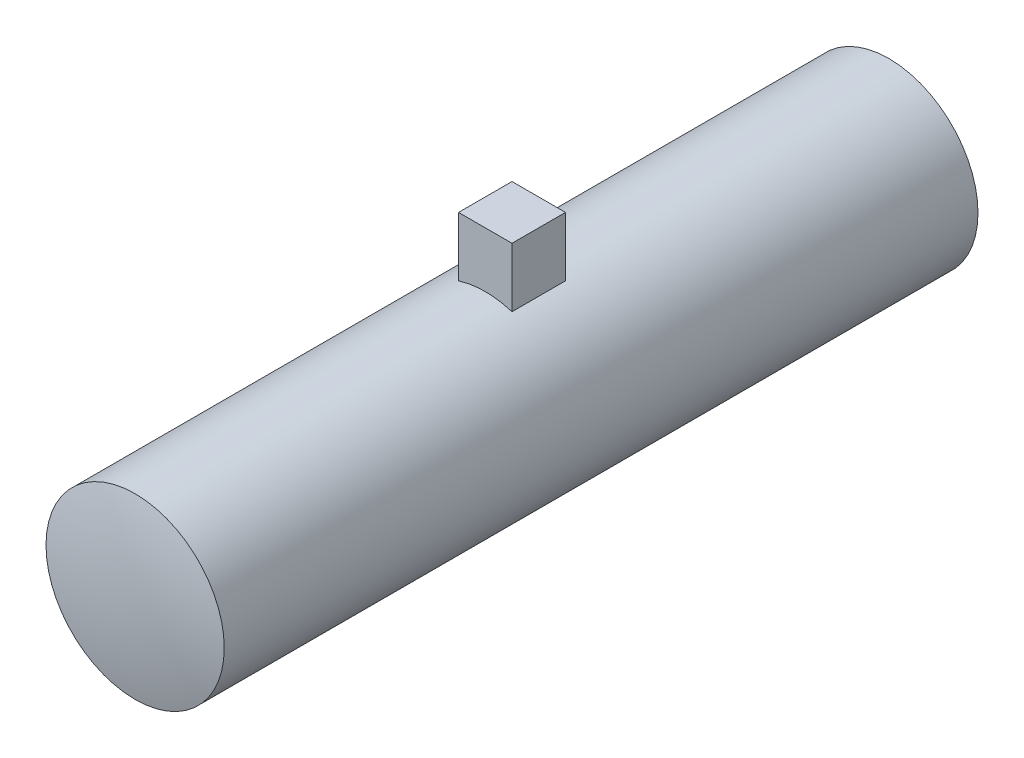
ISO-10303-21;
HEADER;
FILE_DESCRIPTION(('STEP AP214'),'2;1');
FILE_NAME('part.step','',(''),(''),'','','');
FILE_SCHEMA(('AUTOMOTIVE_DESIGN { 1 0 10303 214 1 1 1 1 }'));
ENDSEC;
DATA;
#1=APPLICATION_CONTEXT('core data for automotive mechanical design processes');
#2=APPLICATION_PROTOCOL_DEFINITION('international standard','automotive_design',2000,#1);
#3=PRODUCT_CONTEXT('',#1,'mechanical');
#4=PRODUCT('Part','Part','',(#3));
#5=PRODUCT_RELATED_PRODUCT_CATEGORY('part','',(#4));
#6=PRODUCT_DEFINITION_FORMATION('','',#4);
#7=PRODUCT_DEFINITION_CONTEXT('part definition',#1,'design');
#8=PRODUCT_DEFINITION('design','',#6,#7);
#9=PRODUCT_DEFINITION_SHAPE('','',#8);
#10=(LENGTH_UNIT() NAMED_UNIT(*) SI_UNIT(.MILLI.,.METRE.));
#11=(NAMED_UNIT(*) PLANE_ANGLE_UNIT() SI_UNIT($,.RADIAN.));
#12=(NAMED_UNIT(*) SI_UNIT($,.STERADIAN.) SOLID_ANGLE_UNIT());
#13=UNCERTAINTY_MEASURE_WITH_UNIT(LENGTH_MEASURE(1.E-05),#10,'distance_accuracy_value','');
#14=(GEOMETRIC_REPRESENTATION_CONTEXT(3) GLOBAL_UNCERTAINTY_ASSIGNED_CONTEXT((#13)) GLOBAL_UNIT_ASSIGNED_CONTEXT((#10,
#11,#12)) REPRESENTATION_CONTEXT('',''));
#15=CARTESIAN_POINT('',(0.,0.,0.));
#16=DIRECTION('',(0.,0.,1.));
#17=DIRECTION('',(1.,0.,0.));
#18=AXIS2_PLACEMENT_3D('',#15,#16,#17);
#19=CARTESIAN_POINT('',(67.5239734830013,-22.0957790107268,0.));
#20=DIRECTION('',(0.,-1.,0.));
#21=DIRECTION('',(-1.,0.,0.));
#22=AXIS2_PLACEMENT_3D('',#19,#20,#21);
#23=SPHERICAL_SURFACE('',#22,21.73);
#24=CARTESIAN_POINT('',(67.5239734830013,-22.0957790107268,0.));
#25=DIRECTION('',(0.,0.,1.));
#26=DIRECTION('',(1.,0.,0.));
#27=AXIS2_PLACEMENT_3D('',#24,#25,#26);
#28=SPHERICAL_SURFACE('',#27,21.73);
#29=CARTESIAN_POINT('',(67.5239734830013,-22.0957790107268,-21.1469359482645));
#30=DIRECTION('',(0.,0.,1.));
#31=DIRECTION('',(1.,0.,0.));
#32=AXIS2_PLACEMENT_3D('',#29,#30,#31);
#33=CIRCLE('',#32,5.);
#34=CARTESIAN_POINT('',(72.5239734830013,-22.0957790107268,-21.1469359482645));
#35=VERTEX_POINT('',#34);
#36=EDGE_CURVE('E106',#35,#35,#33,.F.);
#37=ORIENTED_EDGE('',*,*,#36,.T.);
#38=EDGE_LOOP('',(#37));
#39=FACE_BOUND('',#38,.T.);
#40=ADVANCED_FACE('F35',(#39),#28,.T.);
#41=CARTESIAN_POINT('',(67.5239734830013,-22.0957790107268,65.));
#42=DIRECTION('',(0.,0.,-1.));
#43=DIRECTION('',(-1.,0.,0.));
#44=AXIS2_PLACEMENT_3D('',#41,#42,#43);
#45=CYLINDRICAL_SURFACE('',#44,5.);
#46=CARTESIAN_POINT('',(67.5239734830013,-22.0957790107268,-1.5));
#47=DIRECTION('',(0.,0.,-1.));
#48=DIRECTION('',(-1.,0.,0.));
#49=AXIS2_PLACEMENT_3D('',#46,#47,#48);
#50=CIRCLE('',#49,5.);
#51=CARTESIAN_POINT('',(66.0239734830012,-17.326083003642,-1.5));
#52=VERTEX_POINT('',#51);
#53=CARTESIAN_POINT('',(69.0239734830012,-17.326083003642,-1.5));
#54=VERTEX_POINT('',#53);
#55=EDGE_CURVE('E43',#52,#54,#50,.T.);
#56=ORIENTED_EDGE('',*,*,#55,.T.);
#57=DIRECTION('',(0.,0.,-1.));
#58=VECTOR('',#57,1.);
#59=CARTESIAN_POINT('',(69.0239734830012,-17.326083003642,65.));
#60=LINE('',#59,#58);
#61=CARTESIAN_POINT('',(69.0239734830012,-17.326083003642,1.5));
#62=VERTEX_POINT('',#61);
#63=EDGE_CURVE('E12',#54,#62,#60,.F.);
#64=ORIENTED_EDGE('',*,*,#63,.T.);
#65=CARTESIAN_POINT('',(67.5239734830013,-22.0957790107268,1.5));
#66=DIRECTION('',(0.,0.,-1.));
#67=DIRECTION('',(-1.,0.,0.));
#68=AXIS2_PLACEMENT_3D('',#65,#66,#67);
#69=CIRCLE('',#68,5.);
#70=CARTESIAN_POINT('',(66.0239734830012,-17.326083003642,1.5));
#71=VERTEX_POINT('',#70);
#72=EDGE_CURVE('E109',#71,#62,#69,.T.);
#73=ORIENTED_EDGE('',*,*,#72,.F.);
#74=DIRECTION('',(0.,0.,-1.));
#75=VECTOR('',#74,1.);
#76=CARTESIAN_POINT('',(66.0239734830012,-17.326083003642,65.));
#77=LINE('',#76,#75);
#78=EDGE_CURVE('E53',#52,#71,#77,.F.);
#79=ORIENTED_EDGE('',*,*,#78,.F.);
#80=EDGE_LOOP('',(#56,#64,#73,#79));
#81=FACE_BOUND('',#80,.T.);
#82=CARTESIAN_POINT('',(67.5239734830013,-22.0957790107268,21.1469359482645));
#83=DIRECTION('',(0.,0.,-1.));
#84=DIRECTION('',(-1.,0.,0.));
#85=AXIS2_PLACEMENT_3D('',#82,#83,#84);
#86=CIRCLE('',#85,5.);
#87=CARTESIAN_POINT('',(62.5239734830012,-22.0957790107268,21.1469359482645));
#88=VERTEX_POINT('',#87);
#89=EDGE_CURVE('E79',#88,#88,#86,.F.);
#90=ORIENTED_EDGE('',*,*,#89,.F.);
#91=EDGE_LOOP('',(#90));
#92=FACE_BOUND('',#91,.T.);
#93=ORIENTED_EDGE('',*,*,#36,.F.);
#94=EDGE_LOOP('',(#93));
#95=FACE_BOUND('',#94,.T.);
#96=ADVANCED_FACE('F117',(#81,#92,#95),#45,.T.);
#97=CARTESIAN_POINT('',(67.5239734830013,-22.0957790107268,0.));
#98=DIRECTION('',(0.,0.,-1.));
#99=DIRECTION('',(-1.,0.,0.));
#100=AXIS2_PLACEMENT_3D('',#97,#98,#99);
#101=SPHERICAL_SURFACE('',#100,21.73);
#102=ORIENTED_EDGE('',*,*,#89,.T.);
#103=EDGE_LOOP('',(#102));
#104=FACE_BOUND('',#103,.T.);
#105=ADVANCED_FACE('F37',(#104),#101,.T.);
#106=CARTESIAN_POINT('',(69.0239734830012,-14.,0.));
#107=DIRECTION('',(1.,0.,0.));
#108=DIRECTION('',(0.,0.,-1.));
#109=AXIS2_PLACEMENT_3D('',#106,#107,#108);
#110=PLANE('',#109);
#111=ORIENTED_EDGE('',*,*,#63,.F.);
#112=DIRECTION('',(0.,-1.,0.));
#113=VECTOR('',#112,1.);
#114=CARTESIAN_POINT('',(69.0239734830012,-14.,-1.5));
#115=LINE('',#114,#113);
#116=CARTESIAN_POINT('',(69.0239734830012,-14.,-1.5));
#117=VERTEX_POINT('',#116);
#118=EDGE_CURVE('E72',#117,#54,#115,.T.);
#119=ORIENTED_EDGE('',*,*,#118,.F.);
#120=DIRECTION('',(0.,0.,1.));
#121=VECTOR('',#120,1.);
#122=CARTESIAN_POINT('',(69.0239734830012,-14.,0.));
#123=LINE('',#122,#121);
#124=CARTESIAN_POINT('',(69.0239734830012,-14.,1.5));
#125=VERTEX_POINT('',#124);
#126=EDGE_CURVE('E76',#117,#125,#123,.T.);
#127=ORIENTED_EDGE('',*,*,#126,.T.);
#128=DIRECTION('',(0.,-1.,0.));
#129=VECTOR('',#128,1.);
#130=CARTESIAN_POINT('',(69.0239734830012,-14.,1.5));
#131=LINE('',#130,#129);
#132=EDGE_CURVE('E98',#125,#62,#131,.T.);
#133=ORIENTED_EDGE('',*,*,#132,.T.);
#134=EDGE_LOOP('',(#111,#119,#127,#133));
#135=FACE_BOUND('',#134,.T.);
#136=ADVANCED_FACE('F74',(#135),#110,.T.);
#137=CARTESIAN_POINT('',(66.0239734830012,-14.,0.));
#138=DIRECTION('',(1.,0.,0.));
#139=DIRECTION('',(0.,0.,-1.));
#140=AXIS2_PLACEMENT_3D('',#137,#138,#139);
#141=PLANE('',#140);
#142=DIRECTION('',(0.,-1.,0.));
#143=VECTOR('',#142,1.);
#144=CARTESIAN_POINT('',(66.0239734830012,-14.,-1.5));
#145=LINE('',#144,#143);
#146=CARTESIAN_POINT('',(66.0239734830012,-14.,-1.5));
#147=VERTEX_POINT('',#146);
#148=EDGE_CURVE('E80',#147,#52,#145,.T.);
#149=ORIENTED_EDGE('',*,*,#148,.T.);
#150=ORIENTED_EDGE('',*,*,#78,.T.);
#151=DIRECTION('',(0.,-1.,0.));
#152=VECTOR('',#151,1.);
#153=CARTESIAN_POINT('',(66.0239734830012,-14.,1.5));
#154=LINE('',#153,#152);
#155=CARTESIAN_POINT('',(66.0239734830012,-14.,1.5));
#156=VERTEX_POINT('',#155);
#157=EDGE_CURVE('E100',#156,#71,#154,.T.);
#158=ORIENTED_EDGE('',*,*,#157,.F.);
#159=DIRECTION('',(0.,0.,1.));
#160=VECTOR('',#159,1.);
#161=CARTESIAN_POINT('',(66.0239734830012,-14.,0.));
#162=LINE('',#161,#160);
#163=EDGE_CURVE('E93',#147,#156,#162,.T.);
#164=ORIENTED_EDGE('',*,*,#163,.F.);
#165=EDGE_LOOP('',(#149,#150,#158,#164));
#166=FACE_BOUND('',#165,.T.);
#167=ADVANCED_FACE('F114',(#166),#141,.F.);
#168=CARTESIAN_POINT('',(0.,-14.,-1.5));
#169=DIRECTION('',(0.,0.,-1.));
#170=DIRECTION('',(-1.,0.,0.));
#171=AXIS2_PLACEMENT_3D('',#168,#169,#170);
#172=PLANE('',#171);
#173=ORIENTED_EDGE('',*,*,#55,.F.);
#174=ORIENTED_EDGE('',*,*,#148,.F.);
#175=DIRECTION('',(1.,0.,0.));
#176=VECTOR('',#175,1.);
#177=CARTESIAN_POINT('',(0.,-14.,-1.5));
#178=LINE('',#177,#176);
#179=EDGE_CURVE('E85',#147,#117,#178,.T.);
#180=ORIENTED_EDGE('',*,*,#179,.T.);
#181=ORIENTED_EDGE('',*,*,#118,.T.);
#182=EDGE_LOOP('',(#173,#174,#180,#181));
#183=FACE_BOUND('',#182,.T.);
#184=ADVANCED_FACE('F90',(#183),#172,.T.);
#185=CARTESIAN_POINT('',(0.,-14.,1.5));
#186=DIRECTION('',(0.,0.,-1.));
#187=DIRECTION('',(-1.,0.,0.));
#188=AXIS2_PLACEMENT_3D('',#185,#186,#187);
#189=PLANE('',#188);
#190=ORIENTED_EDGE('',*,*,#157,.T.);
#191=ORIENTED_EDGE('',*,*,#72,.T.);
#192=ORIENTED_EDGE('',*,*,#132,.F.);
#193=DIRECTION('',(1.,0.,0.));
#194=VECTOR('',#193,1.);
#195=CARTESIAN_POINT('',(0.,-14.,1.5));
#196=LINE('',#195,#194);
#197=EDGE_CURVE('E87',#156,#125,#196,.T.);
#198=ORIENTED_EDGE('',*,*,#197,.F.);
#199=EDGE_LOOP('',(#190,#191,#192,#198));
#200=FACE_BOUND('',#199,.T.);
#201=ADVANCED_FACE('F116',(#200),#189,.F.);
#202=CARTESIAN_POINT('',(0.,-14.,0.));
#203=DIRECTION('',(0.,1.,0.));
#204=DIRECTION('',(0.,0.,1.));
#205=AXIS2_PLACEMENT_3D('',#202,#203,#204);
#206=PLANE('',#205);
#207=ORIENTED_EDGE('',*,*,#126,.F.);
#208=ORIENTED_EDGE('',*,*,#179,.F.);
#209=ORIENTED_EDGE('',*,*,#163,.T.);
#210=ORIENTED_EDGE('',*,*,#197,.T.);
#211=EDGE_LOOP('',(#207,#208,#209,#210));
#212=FACE_BOUND('',#211,.T.);
#213=ADVANCED_FACE('F84',(#212),#206,.T.);
#214=CLOSED_SHELL('',(#40,#96,#105,#136,#167,#184,#201,#213));
#215=MANIFOLD_SOLID_BREP('B2',#214);
#216=ADVANCED_BREP_SHAPE_REPRESENTATION('',(#18,#215),#14);
#217=SHAPE_DEFINITION_REPRESENTATION(#9,#216);
ENDSEC;
END-ISO-10303-21;
